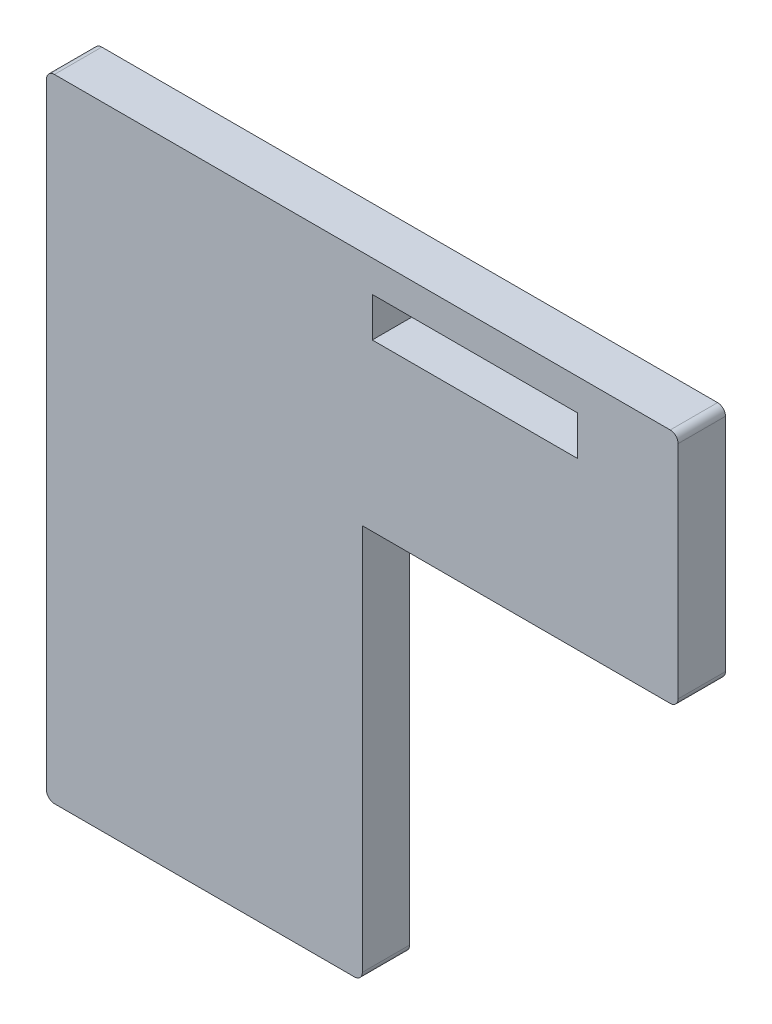
ISO-10303-21;
HEADER;
FILE_DESCRIPTION(('STEP AP214'),'2;1');
FILE_NAME('part.step','',(''),(''),'','','');
FILE_SCHEMA(('AUTOMOTIVE_DESIGN { 1 0 10303 214 1 1 1 1 }'));
ENDSEC;
DATA;
#1=APPLICATION_CONTEXT('core data for automotive mechanical design processes');
#2=APPLICATION_PROTOCOL_DEFINITION('international standard','automotive_design',2000,#1);
#3=PRODUCT_CONTEXT('',#1,'mechanical');
#4=PRODUCT('Part','Part','',(#3));
#5=PRODUCT_RELATED_PRODUCT_CATEGORY('part','',(#4));
#6=PRODUCT_DEFINITION_FORMATION('','',#4);
#7=PRODUCT_DEFINITION_CONTEXT('part definition',#1,'design');
#8=PRODUCT_DEFINITION('design','',#6,#7);
#9=PRODUCT_DEFINITION_SHAPE('','',#8);
#10=(LENGTH_UNIT() NAMED_UNIT(*) SI_UNIT(.MILLI.,.METRE.));
#11=(NAMED_UNIT(*) PLANE_ANGLE_UNIT() SI_UNIT($,.RADIAN.));
#12=(NAMED_UNIT(*) SI_UNIT($,.STERADIAN.) SOLID_ANGLE_UNIT());
#13=UNCERTAINTY_MEASURE_WITH_UNIT(LENGTH_MEASURE(1.E-05),#10,'distance_accuracy_value','');
#14=(GEOMETRIC_REPRESENTATION_CONTEXT(3) GLOBAL_UNCERTAINTY_ASSIGNED_CONTEXT((#13)) GLOBAL_UNIT_ASSIGNED_CONTEXT((#10,
#11,#12)) REPRESENTATION_CONTEXT('',''));
#15=CARTESIAN_POINT('',(0.,0.,0.));
#16=DIRECTION('',(0.,0.,1.));
#17=DIRECTION('',(1.,0.,0.));
#18=AXIS2_PLACEMENT_3D('',#15,#16,#17);
#19=CARTESIAN_POINT('',(-10.,21.25,3.));
#20=DIRECTION('',(1.,0.,0.));
#21=DIRECTION('',(0.,1.,0.));
#22=AXIS2_PLACEMENT_3D('',#19,#20,#21);
#23=PLANE('',#22);
#24=DIRECTION('',(0.,-1.,0.));
#25=VECTOR('',#24,1.);
#26=CARTESIAN_POINT('',(-10.,21.25,3.));
#27=LINE('',#26,#25);
#28=CARTESIAN_POINT('',(-10.,20.75,3.));
#29=VERTEX_POINT('',#28);
#30=CARTESIAN_POINT('',(-10.,-18.25,3.));
#31=VERTEX_POINT('',#30);
#32=EDGE_CURVE('E175',#29,#31,#27,.T.);
#33=ORIENTED_EDGE('',*,*,#32,.F.);
#34=DIRECTION('',(0.,0.,-1.));
#35=VECTOR('',#34,1.);
#36=CARTESIAN_POINT('',(-10.,20.75,3.));
#37=LINE('',#36,#35);
#38=CARTESIAN_POINT('',(-10.,20.75,0.));
#39=VERTEX_POINT('',#38);
#40=EDGE_CURVE('E213',#29,#39,#37,.T.);
#41=ORIENTED_EDGE('',*,*,#40,.T.);
#42=DIRECTION('',(0.,-1.,0.));
#43=VECTOR('',#42,1.);
#44=CARTESIAN_POINT('',(-10.,21.25,0.));
#45=LINE('',#44,#43);
#46=CARTESIAN_POINT('',(-10.,-18.25,0.));
#47=VERTEX_POINT('',#46);
#48=EDGE_CURVE('E146',#39,#47,#45,.T.);
#49=ORIENTED_EDGE('',*,*,#48,.T.);
#50=DIRECTION('',(0.,0.,-1.));
#51=VECTOR('',#50,1.);
#52=CARTESIAN_POINT('',(-10.,-18.25,3.));
#53=LINE('',#52,#51);
#54=EDGE_CURVE('E211',#47,#31,#53,.F.);
#55=ORIENTED_EDGE('',*,*,#54,.T.);
#56=EDGE_LOOP('',(#33,#41,#49,#55));
#57=FACE_BOUND('',#56,.T.);
#58=ADVANCED_FACE('F34',(#57),#23,.F.);
#59=CARTESIAN_POINT('',(-10.,-18.75,3.));
#60=DIRECTION('',(0.,1.,0.));
#61=DIRECTION('',(-1.,0.,0.));
#62=AXIS2_PLACEMENT_3D('',#59,#60,#61);
#63=PLANE('',#62);
#64=DIRECTION('',(1.,0.,0.));
#65=VECTOR('',#64,1.);
#66=CARTESIAN_POINT('',(-10.,-18.75,3.));
#67=LINE('',#66,#65);
#68=CARTESIAN_POINT('',(-9.5,-18.75,3.));
#69=VERTEX_POINT('',#68);
#70=CARTESIAN_POINT('',(9.50000000000001,-18.75,3.));
#71=VERTEX_POINT('',#70);
#72=EDGE_CURVE('E178',#69,#71,#67,.T.);
#73=ORIENTED_EDGE('',*,*,#72,.F.);
#74=DIRECTION('',(0.,0.,-1.));
#75=VECTOR('',#74,1.);
#76=CARTESIAN_POINT('',(-9.5,-18.75,3.));
#77=LINE('',#76,#75);
#78=CARTESIAN_POINT('',(-9.5,-18.75,0.));
#79=VERTEX_POINT('',#78);
#80=EDGE_CURVE('E243',#69,#79,#77,.T.);
#81=ORIENTED_EDGE('',*,*,#80,.T.);
#82=DIRECTION('',(1.,0.,0.));
#83=VECTOR('',#82,1.);
#84=CARTESIAN_POINT('',(-10.,-18.75,0.));
#85=LINE('',#84,#83);
#86=CARTESIAN_POINT('',(9.50000000000001,-18.75,0.));
#87=VERTEX_POINT('',#86);
#88=EDGE_CURVE('E196',#79,#87,#85,.T.);
#89=ORIENTED_EDGE('',*,*,#88,.T.);
#90=DIRECTION('',(0.,0.,-1.));
#91=VECTOR('',#90,1.);
#92=CARTESIAN_POINT('',(9.50000000000001,-18.75,3.));
#93=LINE('',#92,#91);
#94=EDGE_CURVE('E241',#87,#71,#93,.F.);
#95=ORIENTED_EDGE('',*,*,#94,.T.);
#96=EDGE_LOOP('',(#73,#81,#89,#95));
#97=FACE_BOUND('',#96,.T.);
#98=ADVANCED_FACE('F285',(#97),#63,.F.);
#99=CARTESIAN_POINT('',(10.,6.25,3.));
#100=DIRECTION('',(-1.,0.,0.));
#101=DIRECTION('',(0.,-1.,0.));
#102=AXIS2_PLACEMENT_3D('',#99,#100,#101);
#103=PLANE('',#102);
#104=DIRECTION('',(0.,1.,0.));
#105=VECTOR('',#104,1.);
#106=CARTESIAN_POINT('',(10.,6.25,3.));
#107=LINE('',#106,#105);
#108=CARTESIAN_POINT('',(10.,-18.25,3.));
#109=VERTEX_POINT('',#108);
#110=CARTESIAN_POINT('',(10.,6.25,3.));
#111=VERTEX_POINT('',#110);
#112=EDGE_CURVE('E182',#109,#111,#107,.T.);
#113=ORIENTED_EDGE('',*,*,#112,.F.);
#114=DIRECTION('',(0.,0.,-1.));
#115=VECTOR('',#114,1.);
#116=CARTESIAN_POINT('',(10.,-18.25,3.));
#117=LINE('',#116,#115);
#118=CARTESIAN_POINT('',(10.,-18.25,0.));
#119=VERTEX_POINT('',#118);
#120=EDGE_CURVE('E246',#109,#119,#117,.T.);
#121=ORIENTED_EDGE('',*,*,#120,.T.);
#122=DIRECTION('',(0.,1.,0.));
#123=VECTOR('',#122,1.);
#124=CARTESIAN_POINT('',(10.,6.25,0.));
#125=LINE('',#124,#123);
#126=CARTESIAN_POINT('',(10.,6.25,0.));
#127=VERTEX_POINT('',#126);
#128=EDGE_CURVE('E199',#119,#127,#125,.T.);
#129=ORIENTED_EDGE('',*,*,#128,.T.);
#130=DIRECTION('',(0.,0.,-1.));
#131=VECTOR('',#130,1.);
#132=CARTESIAN_POINT('',(10.,6.25,3.));
#133=LINE('',#132,#131);
#134=EDGE_CURVE('E193',#111,#127,#133,.T.);
#135=ORIENTED_EDGE('',*,*,#134,.F.);
#136=EDGE_LOOP('',(#113,#121,#129,#135));
#137=FACE_BOUND('',#136,.T.);
#138=ADVANCED_FACE('F294',(#137),#103,.F.);
#139=CARTESIAN_POINT('',(30.,6.25,3.));
#140=DIRECTION('',(0.,1.,0.));
#141=DIRECTION('',(-1.,0.,0.));
#142=AXIS2_PLACEMENT_3D('',#139,#140,#141);
#143=PLANE('',#142);
#144=DIRECTION('',(1.,0.,0.));
#145=VECTOR('',#144,1.);
#146=CARTESIAN_POINT('',(30.,6.25,0.));
#147=LINE('',#146,#145);
#148=CARTESIAN_POINT('',(29.5,6.25,0.));
#149=VERTEX_POINT('',#148);
#150=EDGE_CURVE('E201',#127,#149,#147,.T.);
#151=ORIENTED_EDGE('',*,*,#150,.T.);
#152=DIRECTION('',(0.,0.,-1.));
#153=VECTOR('',#152,1.);
#154=CARTESIAN_POINT('',(29.5,6.25,3.));
#155=LINE('',#154,#153);
#156=CARTESIAN_POINT('',(29.5,6.25,3.));
#157=VERTEX_POINT('',#156);
#158=EDGE_CURVE('E11',#149,#157,#155,.F.);
#159=ORIENTED_EDGE('',*,*,#158,.T.);
#160=DIRECTION('',(1.,0.,0.));
#161=VECTOR('',#160,1.);
#162=CARTESIAN_POINT('',(30.,6.25,3.));
#163=LINE('',#162,#161);
#164=EDGE_CURVE('E184',#111,#157,#163,.T.);
#165=ORIENTED_EDGE('',*,*,#164,.F.);
#166=ORIENTED_EDGE('',*,*,#134,.T.);
#167=EDGE_LOOP('',(#151,#159,#165,#166));
#168=FACE_BOUND('',#167,.T.);
#169=ADVANCED_FACE('F298',(#168),#143,.F.);
#170=CARTESIAN_POINT('',(30.,21.25,3.));
#171=DIRECTION('',(-1.,0.,0.));
#172=DIRECTION('',(0.,-1.,0.));
#173=AXIS2_PLACEMENT_3D('',#170,#171,#172);
#174=PLANE('',#173);
#175=DIRECTION('',(0.,1.,0.));
#176=VECTOR('',#175,1.);
#177=CARTESIAN_POINT('',(30.,21.25,3.));
#178=LINE('',#177,#176);
#179=CARTESIAN_POINT('',(30.,6.75,3.));
#180=VERTEX_POINT('',#179);
#181=CARTESIAN_POINT('',(30.,20.75,3.));
#182=VERTEX_POINT('',#181);
#183=EDGE_CURVE('E187',#180,#182,#178,.T.);
#184=ORIENTED_EDGE('',*,*,#183,.F.);
#185=DIRECTION('',(0.,0.,-1.));
#186=VECTOR('',#185,1.);
#187=CARTESIAN_POINT('',(30.,6.75,3.));
#188=LINE('',#187,#186);
#189=CARTESIAN_POINT('',(30.,6.75,0.));
#190=VERTEX_POINT('',#189);
#191=EDGE_CURVE('E42',#180,#190,#188,.T.);
#192=ORIENTED_EDGE('',*,*,#191,.T.);
#193=DIRECTION('',(0.,1.,0.));
#194=VECTOR('',#193,1.);
#195=CARTESIAN_POINT('',(30.,21.25,0.));
#196=LINE('',#195,#194);
#197=CARTESIAN_POINT('',(30.,20.75,0.));
#198=VERTEX_POINT('',#197);
#199=EDGE_CURVE('E204',#190,#198,#196,.T.);
#200=ORIENTED_EDGE('',*,*,#199,.T.);
#201=DIRECTION('',(0.,0.,-1.));
#202=VECTOR('',#201,1.);
#203=CARTESIAN_POINT('',(30.,20.75,3.));
#204=LINE('',#203,#202);
#205=EDGE_CURVE('E249',#198,#182,#204,.F.);
#206=ORIENTED_EDGE('',*,*,#205,.T.);
#207=EDGE_LOOP('',(#184,#192,#200,#206));
#208=FACE_BOUND('',#207,.T.);
#209=ADVANCED_FACE('F255',(#208),#174,.F.);
#210=CARTESIAN_POINT('',(-10.,21.25,3.));
#211=DIRECTION('',(0.,-1.,0.));
#212=DIRECTION('',(0.,0.,-1.));
#213=AXIS2_PLACEMENT_3D('',#210,#211,#212);
#214=PLANE('',#213);
#215=DIRECTION('',(-1.,0.,0.));
#216=VECTOR('',#215,1.);
#217=CARTESIAN_POINT('',(-10.,21.25,0.));
#218=LINE('',#217,#216);
#219=CARTESIAN_POINT('',(29.5,21.25,0.));
#220=VERTEX_POINT('',#219);
#221=CARTESIAN_POINT('',(-9.5,21.25,0.));
#222=VERTEX_POINT('',#221);
#223=EDGE_CURVE('E179',#220,#222,#218,.T.);
#224=ORIENTED_EDGE('',*,*,#223,.T.);
#225=DIRECTION('',(0.,0.,-1.));
#226=VECTOR('',#225,1.);
#227=CARTESIAN_POINT('',(-9.5,21.25,3.));
#228=LINE('',#227,#226);
#229=CARTESIAN_POINT('',(-9.5,21.25,3.));
#230=VERTEX_POINT('',#229);
#231=EDGE_CURVE('E229',#222,#230,#228,.F.);
#232=ORIENTED_EDGE('',*,*,#231,.T.);
#233=DIRECTION('',(-1.,0.,0.));
#234=VECTOR('',#233,1.);
#235=CARTESIAN_POINT('',(10.,21.25,3.));
#236=LINE('',#235,#234);
#237=CARTESIAN_POINT('',(29.5,21.25,3.));
#238=VERTEX_POINT('',#237);
#239=EDGE_CURVE('E190',#238,#230,#236,.T.);
#240=ORIENTED_EDGE('',*,*,#239,.F.);
#241=DIRECTION('',(0.,0.,-1.));
#242=VECTOR('',#241,1.);
#243=CARTESIAN_POINT('',(29.5,21.25,3.));
#244=LINE('',#243,#242);
#245=EDGE_CURVE('E226',#238,#220,#244,.T.);
#246=ORIENTED_EDGE('',*,*,#245,.T.);
#247=EDGE_LOOP('',(#224,#232,#240,#246));
#248=FACE_BOUND('',#247,.T.);
#249=ADVANCED_FACE('F269',(#248),#214,.F.);
#250=CARTESIAN_POINT('',(0.,0.,3.));
#251=DIRECTION('',(0.,0.,1.));
#252=DIRECTION('',(1.,0.,0.));
#253=AXIS2_PLACEMENT_3D('',#250,#251,#252);
#254=PLANE('',#253);
#255=DIRECTION('',(0.,-1.,0.));
#256=VECTOR('',#255,1.);
#257=CARTESIAN_POINT('',(23.6302282117293,19.25,3.));
#258=LINE('',#257,#256);
#259=CARTESIAN_POINT('',(23.6302282117293,19.25,3.));
#260=VERTEX_POINT('',#259);
#261=CARTESIAN_POINT('',(23.6302282117293,16.75,3.));
#262=VERTEX_POINT('',#261);
#263=EDGE_CURVE('E150',#260,#262,#258,.T.);
#264=ORIENTED_EDGE('',*,*,#263,.T.);
#265=DIRECTION('',(-1.,0.,0.));
#266=VECTOR('',#265,1.);
#267=CARTESIAN_POINT('',(23.6302282117293,16.75,3.));
#268=LINE('',#267,#266);
#269=CARTESIAN_POINT('',(10.6302282117293,16.75,3.));
#270=VERTEX_POINT('',#269);
#271=EDGE_CURVE('E139',#262,#270,#268,.T.);
#272=ORIENTED_EDGE('',*,*,#271,.T.);
#273=DIRECTION('',(0.,1.,0.));
#274=VECTOR('',#273,1.);
#275=CARTESIAN_POINT('',(10.6302282117293,19.25,3.));
#276=LINE('',#275,#274);
#277=CARTESIAN_POINT('',(10.6302282117293,19.25,3.));
#278=VERTEX_POINT('',#277);
#279=EDGE_CURVE('E161',#270,#278,#276,.T.);
#280=ORIENTED_EDGE('',*,*,#279,.T.);
#281=DIRECTION('',(1.,0.,0.));
#282=VECTOR('',#281,1.);
#283=CARTESIAN_POINT('',(23.6302282117293,19.25,3.));
#284=LINE('',#283,#282);
#285=EDGE_CURVE('E157',#278,#260,#284,.T.);
#286=ORIENTED_EDGE('',*,*,#285,.T.);
#287=EDGE_LOOP('',(#264,#272,#280,#286));
#288=FACE_BOUND('',#287,.T.);
#289=ORIENTED_EDGE('',*,*,#239,.T.);
#290=CARTESIAN_POINT('',(-9.5,20.75,3.));
#291=DIRECTION('',(0.,0.,1.));
#292=DIRECTION('',(1.,0.,0.));
#293=AXIS2_PLACEMENT_3D('',#290,#291,#292);
#294=CIRCLE('',#293,0.5);
#295=EDGE_CURVE('E239',#230,#29,#294,.T.);
#296=ORIENTED_EDGE('',*,*,#295,.T.);
#297=ORIENTED_EDGE('',*,*,#32,.T.);
#298=CARTESIAN_POINT('',(-9.5,-18.25,3.));
#299=DIRECTION('',(0.,0.,1.));
#300=DIRECTION('',(1.,0.,0.));
#301=AXIS2_PLACEMENT_3D('',#298,#299,#300);
#302=CIRCLE('',#301,0.5);
#303=EDGE_CURVE('E237',#31,#69,#302,.T.);
#304=ORIENTED_EDGE('',*,*,#303,.T.);
#305=ORIENTED_EDGE('',*,*,#72,.T.);
#306=CARTESIAN_POINT('',(9.50000000000001,-18.25,3.));
#307=DIRECTION('',(0.,0.,1.));
#308=DIRECTION('',(1.,0.,0.));
#309=AXIS2_PLACEMENT_3D('',#306,#307,#308);
#310=CIRCLE('',#309,0.5);
#311=EDGE_CURVE('E235',#71,#109,#310,.T.);
#312=ORIENTED_EDGE('',*,*,#311,.T.);
#313=ORIENTED_EDGE('',*,*,#112,.T.);
#314=ORIENTED_EDGE('',*,*,#164,.T.);
#315=CARTESIAN_POINT('',(29.5,6.75,3.));
#316=DIRECTION('',(0.,0.,1.));
#317=DIRECTION('',(1.,0.,0.));
#318=AXIS2_PLACEMENT_3D('',#315,#316,#317);
#319=CIRCLE('',#318,0.5);
#320=EDGE_CURVE('E233',#157,#180,#319,.T.);
#321=ORIENTED_EDGE('',*,*,#320,.T.);
#322=ORIENTED_EDGE('',*,*,#183,.T.);
#323=CARTESIAN_POINT('',(29.5,20.75,3.));
#324=DIRECTION('',(0.,0.,1.));
#325=DIRECTION('',(1.,0.,0.));
#326=AXIS2_PLACEMENT_3D('',#323,#324,#325);
#327=CIRCLE('',#326,0.5);
#328=EDGE_CURVE('E231',#182,#238,#327,.T.);
#329=ORIENTED_EDGE('',*,*,#328,.T.);
#330=EDGE_LOOP('',(#289,#296,#297,#304,#305,#312,#313,#314,#321,#322,#329));
#331=FACE_BOUND('',#330,.T.);
#332=ADVANCED_FACE('F155',(#288,#331),#254,.T.);
#333=CARTESIAN_POINT('',(0.,0.,0.));
#334=DIRECTION('',(0.,0.,1.));
#335=DIRECTION('',(1.,0.,0.));
#336=AXIS2_PLACEMENT_3D('',#333,#334,#335);
#337=PLANE('',#336);
#338=DIRECTION('',(-1.,0.,0.));
#339=VECTOR('',#338,1.);
#340=CARTESIAN_POINT('',(23.6302282117293,16.75,0.));
#341=LINE('',#340,#339);
#342=CARTESIAN_POINT('',(23.6302282117293,16.75,0.));
#343=VERTEX_POINT('',#342);
#344=CARTESIAN_POINT('',(10.6302282117293,16.75,0.));
#345=VERTEX_POINT('',#344);
#346=EDGE_CURVE('E159',#343,#345,#341,.T.);
#347=ORIENTED_EDGE('',*,*,#346,.F.);
#348=DIRECTION('',(0.,-1.,0.));
#349=VECTOR('',#348,1.);
#350=CARTESIAN_POINT('',(23.6302282117293,19.25,0.));
#351=LINE('',#350,#349);
#352=CARTESIAN_POINT('',(23.6302282117293,19.25,0.));
#353=VERTEX_POINT('',#352);
#354=EDGE_CURVE('E57',#353,#343,#351,.T.);
#355=ORIENTED_EDGE('',*,*,#354,.F.);
#356=DIRECTION('',(1.,0.,0.));
#357=VECTOR('',#356,1.);
#358=CARTESIAN_POINT('',(23.6302282117293,19.25,0.));
#359=LINE('',#358,#357);
#360=CARTESIAN_POINT('',(10.6302282117293,19.25,0.));
#361=VERTEX_POINT('',#360);
#362=EDGE_CURVE('E152',#361,#353,#359,.T.);
#363=ORIENTED_EDGE('',*,*,#362,.F.);
#364=DIRECTION('',(0.,1.,0.));
#365=VECTOR('',#364,1.);
#366=CARTESIAN_POINT('',(10.6302282117293,19.25,0.));
#367=LINE('',#366,#365);
#368=EDGE_CURVE('E166',#345,#361,#367,.T.);
#369=ORIENTED_EDGE('',*,*,#368,.F.);
#370=EDGE_LOOP('',(#347,#355,#363,#369));
#371=FACE_BOUND('',#370,.T.);
#372=ORIENTED_EDGE('',*,*,#48,.F.);
#373=CARTESIAN_POINT('',(-9.5,20.75,0.));
#374=DIRECTION('',(0.,0.,1.));
#375=DIRECTION('',(1.,0.,0.));
#376=AXIS2_PLACEMENT_3D('',#373,#374,#375);
#377=CIRCLE('',#376,0.5);
#378=EDGE_CURVE('E224',#39,#222,#377,.F.);
#379=ORIENTED_EDGE('',*,*,#378,.T.);
#380=ORIENTED_EDGE('',*,*,#223,.F.);
#381=CARTESIAN_POINT('',(29.5,20.75,0.));
#382=DIRECTION('',(0.,0.,1.));
#383=DIRECTION('',(1.,0.,0.));
#384=AXIS2_PLACEMENT_3D('',#381,#382,#383);
#385=CIRCLE('',#384,0.5);
#386=EDGE_CURVE('E216',#220,#198,#385,.F.);
#387=ORIENTED_EDGE('',*,*,#386,.T.);
#388=ORIENTED_EDGE('',*,*,#199,.F.);
#389=CARTESIAN_POINT('',(29.5,6.75,0.));
#390=DIRECTION('',(0.,0.,1.));
#391=DIRECTION('',(1.,0.,0.));
#392=AXIS2_PLACEMENT_3D('',#389,#390,#391);
#393=CIRCLE('',#392,0.5);
#394=EDGE_CURVE('E218',#190,#149,#393,.F.);
#395=ORIENTED_EDGE('',*,*,#394,.T.);
#396=ORIENTED_EDGE('',*,*,#150,.F.);
#397=ORIENTED_EDGE('',*,*,#128,.F.);
#398=CARTESIAN_POINT('',(9.50000000000001,-18.25,0.));
#399=DIRECTION('',(0.,0.,1.));
#400=DIRECTION('',(1.,0.,0.));
#401=AXIS2_PLACEMENT_3D('',#398,#399,#400);
#402=CIRCLE('',#401,0.5);
#403=EDGE_CURVE('E220',#119,#87,#402,.F.);
#404=ORIENTED_EDGE('',*,*,#403,.T.);
#405=ORIENTED_EDGE('',*,*,#88,.F.);
#406=CARTESIAN_POINT('',(-9.5,-18.25,0.));
#407=DIRECTION('',(0.,0.,1.));
#408=DIRECTION('',(1.,0.,0.));
#409=AXIS2_PLACEMENT_3D('',#406,#407,#408);
#410=CIRCLE('',#409,0.5);
#411=EDGE_CURVE('E222',#79,#47,#410,.F.);
#412=ORIENTED_EDGE('',*,*,#411,.T.);
#413=EDGE_LOOP('',(#372,#379,#380,#387,#388,#395,#396,#397,#404,#405,#412));
#414=FACE_BOUND('',#413,.T.);
#415=ADVANCED_FACE('F261',(#371,#414),#337,.F.);
#416=CARTESIAN_POINT('',(-9.5,20.75,3.));
#417=DIRECTION('',(0.,0.,-1.));
#418=DIRECTION('',(-1.,0.,0.));
#419=AXIS2_PLACEMENT_3D('',#416,#417,#418);
#420=CYLINDRICAL_SURFACE('',#419,0.5);
#421=ORIENTED_EDGE('',*,*,#295,.F.);
#422=ORIENTED_EDGE('',*,*,#231,.F.);
#423=ORIENTED_EDGE('',*,*,#378,.F.);
#424=ORIENTED_EDGE('',*,*,#40,.F.);
#425=EDGE_LOOP('',(#421,#422,#423,#424));
#426=FACE_BOUND('',#425,.T.);
#427=ADVANCED_FACE('F275',(#426),#420,.T.);
#428=CARTESIAN_POINT('',(-9.5,-18.25,3.));
#429=DIRECTION('',(0.,0.,-1.));
#430=DIRECTION('',(-1.,0.,0.));
#431=AXIS2_PLACEMENT_3D('',#428,#429,#430);
#432=CYLINDRICAL_SURFACE('',#431,0.5);
#433=ORIENTED_EDGE('',*,*,#303,.F.);
#434=ORIENTED_EDGE('',*,*,#54,.F.);
#435=ORIENTED_EDGE('',*,*,#411,.F.);
#436=ORIENTED_EDGE('',*,*,#80,.F.);
#437=EDGE_LOOP('',(#433,#434,#435,#436));
#438=FACE_BOUND('',#437,.T.);
#439=ADVANCED_FACE('F282',(#438),#432,.T.);
#440=CARTESIAN_POINT('',(9.50000000000001,-18.25,3.));
#441=DIRECTION('',(0.,0.,-1.));
#442=DIRECTION('',(-1.,0.,0.));
#443=AXIS2_PLACEMENT_3D('',#440,#441,#442);
#444=CYLINDRICAL_SURFACE('',#443,0.5);
#445=ORIENTED_EDGE('',*,*,#311,.F.);
#446=ORIENTED_EDGE('',*,*,#94,.F.);
#447=ORIENTED_EDGE('',*,*,#403,.F.);
#448=ORIENTED_EDGE('',*,*,#120,.F.);
#449=EDGE_LOOP('',(#445,#446,#447,#448));
#450=FACE_BOUND('',#449,.T.);
#451=ADVANCED_FACE('F291',(#450),#444,.T.);
#452=CARTESIAN_POINT('',(29.5,6.75,3.));
#453=DIRECTION('',(0.,0.,-1.));
#454=DIRECTION('',(-1.,0.,0.));
#455=AXIS2_PLACEMENT_3D('',#452,#453,#454);
#456=CYLINDRICAL_SURFACE('',#455,0.5);
#457=ORIENTED_EDGE('',*,*,#320,.F.);
#458=ORIENTED_EDGE('',*,*,#158,.F.);
#459=ORIENTED_EDGE('',*,*,#394,.F.);
#460=ORIENTED_EDGE('',*,*,#191,.F.);
#461=EDGE_LOOP('',(#457,#458,#459,#460));
#462=FACE_BOUND('',#461,.T.);
#463=ADVANCED_FACE('F300',(#462),#456,.T.);
#464=CARTESIAN_POINT('',(29.5,20.75,3.));
#465=DIRECTION('',(0.,0.,-1.));
#466=DIRECTION('',(-1.,0.,0.));
#467=AXIS2_PLACEMENT_3D('',#464,#465,#466);
#468=CYLINDRICAL_SURFACE('',#467,0.5);
#469=ORIENTED_EDGE('',*,*,#328,.F.);
#470=ORIENTED_EDGE('',*,*,#205,.F.);
#471=ORIENTED_EDGE('',*,*,#386,.F.);
#472=ORIENTED_EDGE('',*,*,#245,.F.);
#473=EDGE_LOOP('',(#469,#470,#471,#472));
#474=FACE_BOUND('',#473,.T.);
#475=ADVANCED_FACE('F36',(#474),#468,.T.);
#476=CARTESIAN_POINT('',(23.6302282117293,19.25,3.001));
#477=DIRECTION('',(1.,0.,0.));
#478=DIRECTION('',(0.,0.,-1.));
#479=AXIS2_PLACEMENT_3D('',#476,#477,#478);
#480=PLANE('',#479);
#481=DIRECTION('',(0.,0.,-1.));
#482=VECTOR('',#481,1.);
#483=CARTESIAN_POINT('',(23.6302282117293,19.25,3.001));
#484=LINE('',#483,#482);
#485=EDGE_CURVE('E147',#260,#353,#484,.T.);
#486=ORIENTED_EDGE('',*,*,#485,.T.);
#487=ORIENTED_EDGE('',*,*,#354,.T.);
#488=DIRECTION('',(0.,0.,-1.));
#489=VECTOR('',#488,1.);
#490=CARTESIAN_POINT('',(23.6302282117293,16.75,3.001));
#491=LINE('',#490,#489);
#492=EDGE_CURVE('E141',#262,#343,#491,.T.);
#493=ORIENTED_EDGE('',*,*,#492,.F.);
#494=ORIENTED_EDGE('',*,*,#263,.F.);
#495=EDGE_LOOP('',(#486,#487,#493,#494));
#496=FACE_BOUND('',#495,.T.);
#497=ADVANCED_FACE('F149',(#496),#480,.F.);
#498=CARTESIAN_POINT('',(23.6302282117293,19.25,3.001));
#499=DIRECTION('',(0.,1.,0.));
#500=DIRECTION('',(0.,0.,1.));
#501=AXIS2_PLACEMENT_3D('',#498,#499,#500);
#502=PLANE('',#501);
#503=DIRECTION('',(0.,0.,-1.));
#504=VECTOR('',#503,1.);
#505=CARTESIAN_POINT('',(10.6302282117293,19.25,3.001));
#506=LINE('',#505,#504);
#507=EDGE_CURVE('E172',#278,#361,#506,.T.);
#508=ORIENTED_EDGE('',*,*,#507,.T.);
#509=ORIENTED_EDGE('',*,*,#362,.T.);
#510=ORIENTED_EDGE('',*,*,#485,.F.);
#511=ORIENTED_EDGE('',*,*,#285,.F.);
#512=EDGE_LOOP('',(#508,#509,#510,#511));
#513=FACE_BOUND('',#512,.T.);
#514=ADVANCED_FACE('F365',(#513),#502,.F.);
#515=CARTESIAN_POINT('',(10.6302282117293,19.25,3.001));
#516=DIRECTION('',(-1.,0.,0.));
#517=DIRECTION('',(0.,0.,1.));
#518=AXIS2_PLACEMENT_3D('',#515,#516,#517);
#519=PLANE('',#518);
#520=DIRECTION('',(0.,0.,-1.));
#521=VECTOR('',#520,1.);
#522=CARTESIAN_POINT('',(10.6302282117293,16.75,3.001));
#523=LINE('',#522,#521);
#524=EDGE_CURVE('E49',#270,#345,#523,.T.);
#525=ORIENTED_EDGE('',*,*,#524,.T.);
#526=ORIENTED_EDGE('',*,*,#368,.T.);
#527=ORIENTED_EDGE('',*,*,#507,.F.);
#528=ORIENTED_EDGE('',*,*,#279,.F.);
#529=EDGE_LOOP('',(#525,#526,#527,#528));
#530=FACE_BOUND('',#529,.T.);
#531=ADVANCED_FACE('F374',(#530),#519,.F.);
#532=CARTESIAN_POINT('',(23.6302282117293,16.75,3.001));
#533=DIRECTION('',(0.,-1.,0.));
#534=DIRECTION('',(0.,0.,-1.));
#535=AXIS2_PLACEMENT_3D('',#532,#533,#534);
#536=PLANE('',#535);
#537=ORIENTED_EDGE('',*,*,#492,.T.);
#538=ORIENTED_EDGE('',*,*,#346,.T.);
#539=ORIENTED_EDGE('',*,*,#524,.F.);
#540=ORIENTED_EDGE('',*,*,#271,.F.);
#541=EDGE_LOOP('',(#537,#538,#539,#540));
#542=FACE_BOUND('',#541,.T.);
#543=ADVANCED_FACE('F140',(#542),#536,.F.);
#544=CLOSED_SHELL('',(#58,#98,#138,#169,#209,#249,#332,#415,#427,#439,#451,#463,#475,#497,#514,
#531,#543));
#545=MANIFOLD_SOLID_BREP('B2',#544);
#546=ADVANCED_BREP_SHAPE_REPRESENTATION('',(#18,#545),#14);
#547=SHAPE_DEFINITION_REPRESENTATION(#9,#546);
ENDSEC;
END-ISO-10303-21;
